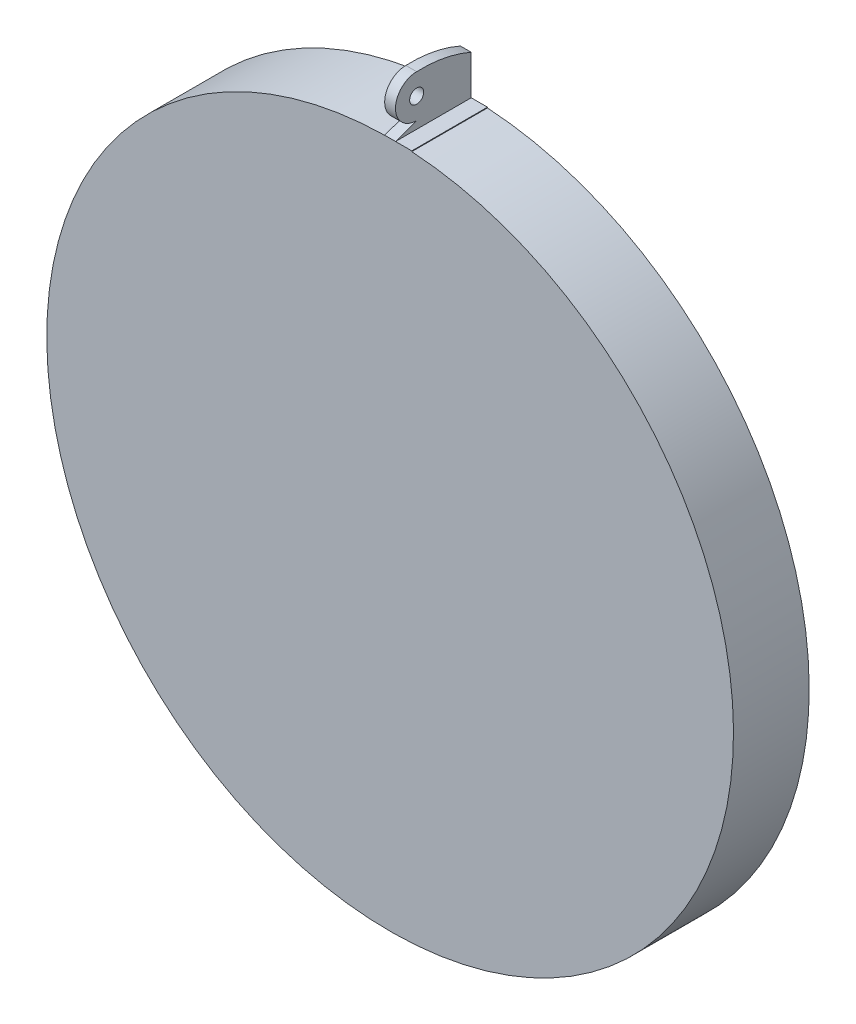
ISO-10303-21;
HEADER;
FILE_DESCRIPTION(('STEP AP214'),'2;1');
FILE_NAME('part.step','',(''),(''),'','','');
FILE_SCHEMA(('AUTOMOTIVE_DESIGN { 1 0 10303 214 1 1 1 1 }'));
ENDSEC;
DATA;
#1=APPLICATION_CONTEXT('core data for automotive mechanical design processes');
#2=APPLICATION_PROTOCOL_DEFINITION('international standard','automotive_design',2000,#1);
#3=PRODUCT_CONTEXT('',#1,'mechanical');
#4=PRODUCT('Part','Part','',(#3));
#5=PRODUCT_RELATED_PRODUCT_CATEGORY('part','',(#4));
#6=PRODUCT_DEFINITION_FORMATION('','',#4);
#7=PRODUCT_DEFINITION_CONTEXT('part definition',#1,'design');
#8=PRODUCT_DEFINITION('design','',#6,#7);
#9=PRODUCT_DEFINITION_SHAPE('','',#8);
#10=(LENGTH_UNIT() NAMED_UNIT(*) SI_UNIT(.MILLI.,.METRE.));
#11=(NAMED_UNIT(*) PLANE_ANGLE_UNIT() SI_UNIT($,.RADIAN.));
#12=(NAMED_UNIT(*) SI_UNIT($,.STERADIAN.) SOLID_ANGLE_UNIT());
#13=UNCERTAINTY_MEASURE_WITH_UNIT(LENGTH_MEASURE(1.E-05),#10,'distance_accuracy_value','');
#14=(GEOMETRIC_REPRESENTATION_CONTEXT(3) GLOBAL_UNCERTAINTY_ASSIGNED_CONTEXT((#13)) GLOBAL_UNIT_ASSIGNED_CONTEXT((#10,
#11,#12)) REPRESENTATION_CONTEXT('',''));
#15=CARTESIAN_POINT('',(0.,0.,0.));
#16=DIRECTION('',(0.,0.,1.));
#17=DIRECTION('',(1.,0.,0.));
#18=AXIS2_PLACEMENT_3D('',#15,#16,#17);
#19=CARTESIAN_POINT('',(0.,0.,42.));
#20=DIRECTION('',(0.,0.,-1.));
#21=DIRECTION('',(-1.,0.,0.));
#22=AXIS2_PLACEMENT_3D('',#19,#20,#21);
#23=CYLINDRICAL_SURFACE('',#22,56.097029569979);
#24=CARTESIAN_POINT('',(0.,0.,20.));
#25=DIRECTION('',(0.,0.,-1.));
#26=DIRECTION('',(-1.,0.,0.));
#27=AXIS2_PLACEMENT_3D('',#24,#25,#26);
#28=CIRCLE('',#27,56.097029569979);
#29=CARTESIAN_POINT('',(-56.097029569979,0.,20.));
#30=VERTEX_POINT('',#29);
#31=EDGE_CURVE('E197',#30,#30,#28,.T.);
#32=ORIENTED_EDGE('',*,*,#31,.T.);
#33=EDGE_LOOP('',(#32));
#34=FACE_BOUND('',#33,.T.);
#35=CARTESIAN_POINT('',(0.,0.,21.));
#36=DIRECTION('',(0.,0.,1.));
#37=DIRECTION('',(1.,0.,0.));
#38=AXIS2_PLACEMENT_3D('',#35,#36,#37);
#39=CIRCLE('',#38,56.097029569979);
#40=CARTESIAN_POINT('',(56.097029569979,0.,21.));
#41=VERTEX_POINT('',#40);
#42=EDGE_CURVE('E11',#41,#41,#39,.F.);
#43=ORIENTED_EDGE('',*,*,#42,.F.);
#44=EDGE_LOOP('',(#43));
#45=FACE_BOUND('',#44,.T.);
#46=ADVANCED_FACE('F39',(#34,#45),#23,.F.);
#47=CARTESIAN_POINT('',(0.,0.,23.));
#48=DIRECTION('',(0.,0.,-1.));
#49=DIRECTION('',(-1.,0.,0.));
#50=AXIS2_PLACEMENT_3D('',#47,#48,#49);
#51=CYLINDRICAL_SURFACE('',#50,63.5);
#52=DIRECTION('',(0.,0.,-1.));
#53=VECTOR('',#52,1.);
#54=CARTESIAN_POINT('',(-0.999999999999986,63.4921254960015,23.));
#55=LINE('',#54,#53);
#56=CARTESIAN_POINT('',(-0.999999999999985,63.4921254960015,23.));
#57=VERTEX_POINT('',#56);
#58=CARTESIAN_POINT('',(-0.999999999999986,63.4921254960015,8.99999999999998));
#59=VERTEX_POINT('',#58);
#60=EDGE_CURVE('E103',#57,#59,#55,.T.);
#61=ORIENTED_EDGE('',*,*,#60,.T.);
#62=CARTESIAN_POINT('',(0.,0.,8.99999999999998));
#63=DIRECTION('',(0.,0.,-1.));
#64=DIRECTION('',(-1.,0.,0.));
#65=AXIS2_PLACEMENT_3D('',#62,#63,#64);
#66=CIRCLE('',#65,63.5);
#67=CARTESIAN_POINT('',(3.99999999999998,63.3738905228328,8.99999999999998));
#68=VERTEX_POINT('',#67);
#69=EDGE_CURVE('E105',#68,#59,#66,.T.);
#70=ORIENTED_EDGE('',*,*,#69,.F.);
#71=DIRECTION('',(0.,0.,-1.));
#72=VECTOR('',#71,1.);
#73=CARTESIAN_POINT('',(3.99999999999998,63.3738905228328,23.));
#74=LINE('',#73,#72);
#75=CARTESIAN_POINT('',(3.99999999999998,63.3738905228328,23.));
#76=VERTEX_POINT('',#75);
#77=EDGE_CURVE('E190',#68,#76,#74,.F.);
#78=ORIENTED_EDGE('',*,*,#77,.T.);
#79=CARTESIAN_POINT('',(0.,0.,23.));
#80=DIRECTION('',(0.,0.,1.));
#81=DIRECTION('',(1.,0.,0.));
#82=AXIS2_PLACEMENT_3D('',#79,#80,#81);
#83=CIRCLE('',#82,63.5);
#84=EDGE_CURVE('E43',#57,#76,#83,.T.);
#85=ORIENTED_EDGE('',*,*,#84,.F.);
#86=EDGE_LOOP('',(#61,#70,#78,#85));
#87=FACE_BOUND('',#86,.T.);
#88=ADVANCED_FACE('F41',(#87),#51,.T.);
#89=CARTESIAN_POINT('',(0.,0.,23.));
#90=DIRECTION('',(0.,0.,-1.));
#91=DIRECTION('',(-1.,0.,0.));
#92=AXIS2_PLACEMENT_3D('',#89,#90,#91);
#93=CYLINDRICAL_SURFACE('',#92,60.5);
#94=CARTESIAN_POINT('',(0.,0.,20.));
#95=DIRECTION('',(0.,0.,1.));
#96=DIRECTION('',(1.,0.,0.));
#97=AXIS2_PLACEMENT_3D('',#94,#95,#96);
#98=CIRCLE('',#97,60.5);
#99=CARTESIAN_POINT('',(60.5,0.,20.));
#100=VERTEX_POINT('',#99);
#101=EDGE_CURVE('E203',#100,#100,#98,.T.);
#102=ORIENTED_EDGE('',*,*,#101,.T.);
#103=EDGE_LOOP('',(#102));
#104=FACE_BOUND('',#103,.T.);
#105=CARTESIAN_POINT('',(0.,0.,8.99999999999998));
#106=DIRECTION('',(0.,0.,-1.));
#107=DIRECTION('',(-1.,0.,0.));
#108=AXIS2_PLACEMENT_3D('',#105,#106,#107);
#109=CIRCLE('',#108,60.5);
#110=CARTESIAN_POINT('',(-60.5,0.,8.99999999999998));
#111=VERTEX_POINT('',#110);
#112=EDGE_CURVE('E122',#111,#111,#109,.T.);
#113=ORIENTED_EDGE('',*,*,#112,.T.);
#114=EDGE_LOOP('',(#113));
#115=FACE_BOUND('',#114,.T.);
#116=ADVANCED_FACE('F252',(#104,#115),#93,.F.);
#117=CARTESIAN_POINT('',(0.,63.5,0.));
#118=DIRECTION('',(0.,-1.,0.));
#119=DIRECTION('',(0.,0.,-1.));
#120=AXIS2_PLACEMENT_3D('',#117,#118,#119);
#121=PLANE('',#120);
#122=DIRECTION('',(0.,0.,1.));
#123=VECTOR('',#122,1.);
#124=CARTESIAN_POINT('',(3.99999999999998,63.5,23.));
#125=LINE('',#124,#123);
#126=CARTESIAN_POINT('',(3.99999999999998,63.5,8.99999999999998));
#127=VERTEX_POINT('',#126);
#128=CARTESIAN_POINT('',(3.99999999999998,63.5,23.));
#129=VERTEX_POINT('',#128);
#130=EDGE_CURVE('E187',#127,#129,#125,.T.);
#131=ORIENTED_EDGE('',*,*,#130,.F.);
#132=DIRECTION('',(-1.,0.,0.));
#133=VECTOR('',#132,1.);
#134=CARTESIAN_POINT('',(0.,63.5,8.99999999999998));
#135=LINE('',#134,#133);
#136=CARTESIAN_POINT('',(0.999999999999986,63.5,8.99999999999998));
#137=VERTEX_POINT('',#136);
#138=EDGE_CURVE('E138',#127,#137,#135,.T.);
#139=ORIENTED_EDGE('',*,*,#138,.T.);
#140=DIRECTION('',(0.,0.,-1.));
#141=VECTOR('',#140,1.);
#142=CARTESIAN_POINT('',(0.999999999999986,63.5,23.));
#143=LINE('',#142,#141);
#144=CARTESIAN_POINT('',(0.999999999999986,63.5,23.));
#145=VERTEX_POINT('',#144);
#146=EDGE_CURVE('E63',#145,#137,#143,.T.);
#147=ORIENTED_EDGE('',*,*,#146,.F.);
#148=DIRECTION('',(-1.,0.,0.));
#149=VECTOR('',#148,1.);
#150=CARTESIAN_POINT('',(-0.999999999999986,63.5,23.));
#151=LINE('',#150,#149);
#152=EDGE_CURVE('E191',#129,#145,#151,.T.);
#153=ORIENTED_EDGE('',*,*,#152,.F.);
#154=EDGE_LOOP('',(#131,#139,#147,#153));
#155=FACE_BOUND('',#154,.T.);
#156=ADVANCED_FACE('F215',(#155),#121,.F.);
#157=CARTESIAN_POINT('',(0.,0.,23.));
#158=DIRECTION('',(0.,0.,1.));
#159=DIRECTION('',(1.,0.,0.));
#160=AXIS2_PLACEMENT_3D('',#157,#158,#159);
#161=PLANE('',#160);
#162=DIRECTION('',(0.,1.,0.));
#163=VECTOR('',#162,1.);
#164=CARTESIAN_POINT('',(-0.999999999999986,-63.501,23.));
#165=LINE('',#164,#163);
#166=CARTESIAN_POINT('',(-0.999999999999986,63.5,23.));
#167=VERTEX_POINT('',#166);
#168=EDGE_CURVE('E112',#57,#167,#165,.T.);
#169=ORIENTED_EDGE('',*,*,#168,.F.);
#170=ORIENTED_EDGE('',*,*,#84,.T.);
#171=DIRECTION('',(0.,1.,0.));
#172=VECTOR('',#171,1.);
#173=CARTESIAN_POINT('',(3.99999999999998,-63.501,23.));
#174=LINE('',#173,#172);
#175=EDGE_CURVE('E183',#76,#129,#174,.T.);
#176=ORIENTED_EDGE('',*,*,#175,.T.);
#177=ORIENTED_EDGE('',*,*,#152,.T.);
#178=EDGE_CURVE('E194',#145,#167,#151,.T.);
#179=ORIENTED_EDGE('',*,*,#178,.T.);
#180=EDGE_LOOP('',(#169,#170,#176,#177,#179));
#181=FACE_BOUND('',#180,.T.);
#182=ADVANCED_FACE('F211',(#181),#161,.T.);
#183=CARTESIAN_POINT('',(0.,0.,20.));
#184=DIRECTION('',(0.,0.,1.));
#185=DIRECTION('',(1.,0.,0.));
#186=AXIS2_PLACEMENT_3D('',#183,#184,#185);
#187=PLANE('',#186);
#188=ORIENTED_EDGE('',*,*,#31,.F.);
#189=EDGE_LOOP('',(#188));
#190=FACE_BOUND('',#189,.T.);
#191=ORIENTED_EDGE('',*,*,#101,.F.);
#192=EDGE_LOOP('',(#191));
#193=FACE_BOUND('',#192,.T.);
#194=ADVANCED_FACE('F241',(#190,#193),#187,.F.);
#195=CARTESIAN_POINT('',(3.99999999999998,-63.501,23.));
#196=DIRECTION('',(-1.,0.,0.));
#197=DIRECTION('',(0.,0.,1.));
#198=AXIS2_PLACEMENT_3D('',#195,#196,#197);
#199=PLANE('',#198);
#200=ORIENTED_EDGE('',*,*,#77,.F.);
#201=DIRECTION('',(0.,1.,0.));
#202=VECTOR('',#201,1.);
#203=CARTESIAN_POINT('',(3.99999999999998,-63.501,8.99999999999998));
#204=LINE('',#203,#202);
#205=EDGE_CURVE('E120',#68,#127,#204,.T.);
#206=ORIENTED_EDGE('',*,*,#205,.T.);
#207=ORIENTED_EDGE('',*,*,#130,.T.);
#208=ORIENTED_EDGE('',*,*,#175,.F.);
#209=EDGE_LOOP('',(#200,#206,#207,#208));
#210=FACE_BOUND('',#209,.T.);
#211=ADVANCED_FACE('F213',(#210),#199,.F.);
#212=CARTESIAN_POINT('',(-0.999999999999986,50.2901693666308,18.1616408489232));
#213=DIRECTION('',(1.,0.,0.));
#214=DIRECTION('',(0.,0.,-1.));
#215=AXIS2_PLACEMENT_3D('',#212,#213,#214);
#216=CYLINDRICAL_SURFACE('',#215,22.4576228414223);
#217=DIRECTION('',(1.,0.,0.));
#218=VECTOR('',#217,1.);
#219=CARTESIAN_POINT('',(-0.999999999999986,70.7940509660479,8.99999999999998));
#220=LINE('',#219,#218);
#221=CARTESIAN_POINT('',(-0.999999999999986,70.7940509660479,8.99999999999998));
#222=VERTEX_POINT('',#221);
#223=CARTESIAN_POINT('',(0.999999999999986,70.7940509660479,8.99999999999998));
#224=VERTEX_POINT('',#223);
#225=EDGE_CURVE('E131',#222,#224,#220,.T.);
#226=ORIENTED_EDGE('',*,*,#225,.F.);
#227=CARTESIAN_POINT('',(-0.999999999999986,50.2901693666308,18.1616408489232));
#228=DIRECTION('',(1.,0.,0.));
#229=DIRECTION('',(0.,0.,1.));
#230=AXIS2_PLACEMENT_3D('',#227,#228,#229);
#231=CIRCLE('',#230,22.4576228414223);
#232=CARTESIAN_POINT('',(-0.999999999999986,72.7284812952258,19.0927592531248));
#233=VERTEX_POINT('',#232);
#234=EDGE_CURVE('E129',#222,#233,#231,.T.);
#235=ORIENTED_EDGE('',*,*,#234,.T.);
#236=DIRECTION('',(1.,0.,0.));
#237=VECTOR('',#236,1.);
#238=CARTESIAN_POINT('',(-0.999999999999986,72.7284812952258,19.0927592531248));
#239=LINE('',#238,#237);
#240=CARTESIAN_POINT('',(0.999999999999986,72.7284812952258,19.0927592531248));
#241=VERTEX_POINT('',#240);
#242=EDGE_CURVE('E179',#233,#241,#239,.T.);
#243=ORIENTED_EDGE('',*,*,#242,.T.);
#244=CARTESIAN_POINT('',(0.999999999999986,50.2901693666308,18.1616408489232));
#245=DIRECTION('',(1.,0.,0.));
#246=DIRECTION('',(0.,0.,1.));
#247=AXIS2_PLACEMENT_3D('',#244,#245,#246);
#248=CIRCLE('',#247,22.4576228414223);
#249=EDGE_CURVE('E152',#224,#241,#248,.T.);
#250=ORIENTED_EDGE('',*,*,#249,.F.);
#251=EDGE_LOOP('',(#226,#235,#243,#250));
#252=FACE_BOUND('',#251,.T.);
#253=ADVANCED_FACE('F231',(#252),#216,.T.);
#254=CARTESIAN_POINT('',(-0.999999999999986,-99.963694164809,-37.5589199816853));
#255=DIRECTION('',(1.,0.,0.));
#256=DIRECTION('',(0.,0.,-1.));
#257=AXIS2_PLACEMENT_3D('',#254,#255,#256);
#258=CYLINDRICAL_SURFACE('',#257,174.320859622004);
#259=CARTESIAN_POINT('',(-0.999999999999986,-99.963694164809,-37.5589199816853));
#260=DIRECTION('',(1.,0.,0.));
#261=DIRECTION('',(0.,0.,-1.));
#262=AXIS2_PLACEMENT_3D('',#259,#260,#261);
#263=CIRCLE('',#262,174.320859622004);
#264=CARTESIAN_POINT('',(-0.999999999999986,64.8948795862415,19.0927592531248));
#265=VERTEX_POINT('',#264);
#266=EDGE_CURVE('E175',#265,#167,#263,.T.);
#267=ORIENTED_EDGE('',*,*,#266,.T.);
#268=ORIENTED_EDGE('',*,*,#178,.F.);
#269=CARTESIAN_POINT('',(0.999999999999986,-99.963694164809,-37.5589199816853));
#270=DIRECTION('',(1.,0.,0.));
#271=DIRECTION('',(0.,0.,-1.));
#272=AXIS2_PLACEMENT_3D('',#269,#270,#271);
#273=CIRCLE('',#272,174.320859622004);
#274=CARTESIAN_POINT('',(0.999999999999986,64.8948795862415,19.0927592531248));
#275=VERTEX_POINT('',#274);
#276=EDGE_CURVE('E159',#275,#145,#273,.T.);
#277=ORIENTED_EDGE('',*,*,#276,.F.);
#278=DIRECTION('',(1.,0.,0.));
#279=VECTOR('',#278,1.);
#280=CARTESIAN_POINT('',(-0.999999999999986,64.8948795862415,19.0927592531248));
#281=LINE('',#280,#279);
#282=EDGE_CURVE('E180',#265,#275,#281,.T.);
#283=ORIENTED_EDGE('',*,*,#282,.F.);
#284=EDGE_LOOP('',(#267,#268,#277,#283));
#285=FACE_BOUND('',#284,.T.);
#286=ADVANCED_FACE('F219',(#285),#258,.T.);
#287=CARTESIAN_POINT('',(-0.999999999999986,68.8116804407337,19.0927592531248));
#288=DIRECTION('',(1.,0.,0.));
#289=DIRECTION('',(0.,0.,-1.));
#290=AXIS2_PLACEMENT_3D('',#287,#288,#289);
#291=CYLINDRICAL_SURFACE('',#290,3.91680085449216);
#292=ORIENTED_EDGE('',*,*,#282,.T.);
#293=CARTESIAN_POINT('',(0.999999999999986,68.8116804407337,19.0927592531248));
#294=DIRECTION('',(1.,0.,0.));
#295=DIRECTION('',(0.,0.,-1.));
#296=AXIS2_PLACEMENT_3D('',#293,#294,#295);
#297=CIRCLE('',#296,3.91680085449216);
#298=EDGE_CURVE('E155',#241,#275,#297,.T.);
#299=ORIENTED_EDGE('',*,*,#298,.F.);
#300=ORIENTED_EDGE('',*,*,#242,.F.);
#301=CARTESIAN_POINT('',(-0.999999999999986,68.8116804407337,19.0927592531248));
#302=DIRECTION('',(1.,0.,0.));
#303=DIRECTION('',(0.,0.,-1.));
#304=AXIS2_PLACEMENT_3D('',#301,#302,#303);
#305=CIRCLE('',#304,3.91680085449216);
#306=EDGE_CURVE('E171',#233,#265,#305,.T.);
#307=ORIENTED_EDGE('',*,*,#306,.T.);
#308=EDGE_LOOP('',(#292,#299,#300,#307));
#309=FACE_BOUND('',#308,.T.);
#310=ADVANCED_FACE('F229',(#309),#291,.T.);
#311=CARTESIAN_POINT('',(-0.999999999999986,50.2901693666308,18.1616408489232));
#312=DIRECTION('',(-1.,0.,0.));
#313=DIRECTION('',(0.,0.,1.));
#314=AXIS2_PLACEMENT_3D('',#311,#312,#313);
#315=PLANE('',#314);
#316=DIRECTION('',(0.,1.,0.));
#317=VECTOR('',#316,1.);
#318=CARTESIAN_POINT('',(-0.999999999999986,50.2901693666308,8.99999999999998));
#319=LINE('',#318,#317);
#320=EDGE_CURVE('E117',#59,#222,#319,.T.);
#321=ORIENTED_EDGE('',*,*,#320,.F.);
#322=ORIENTED_EDGE('',*,*,#60,.F.);
#323=ORIENTED_EDGE('',*,*,#168,.T.);
#324=ORIENTED_EDGE('',*,*,#266,.F.);
#325=ORIENTED_EDGE('',*,*,#306,.F.);
#326=ORIENTED_EDGE('',*,*,#234,.F.);
#327=EDGE_LOOP('',(#321,#322,#323,#324,#325,#326));
#328=FACE_BOUND('',#327,.T.);
#329=CARTESIAN_POINT('',(-0.999999999999986,68.8116804407337,19.0927592531248));
#330=DIRECTION('',(1.,0.,0.));
#331=DIRECTION('',(0.,0.,-1.));
#332=AXIS2_PLACEMENT_3D('',#329,#330,#331);
#333=CIRCLE('',#332,1.3);
#334=CARTESIAN_POINT('',(-0.999999999999986,68.8116804407337,17.7927592531248));
#335=VERTEX_POINT('',#334);
#336=EDGE_CURVE('E165',#335,#335,#333,.T.);
#337=ORIENTED_EDGE('',*,*,#336,.T.);
#338=EDGE_LOOP('',(#337));
#339=FACE_BOUND('',#338,.T.);
#340=ADVANCED_FACE('F126',(#328,#339),#315,.T.);
#341=CARTESIAN_POINT('',(-0.999999999999986,68.8116804407337,19.0927592531248));
#342=DIRECTION('',(1.,0.,0.));
#343=DIRECTION('',(0.,0.,-1.));
#344=AXIS2_PLACEMENT_3D('',#341,#342,#343);
#345=CYLINDRICAL_SURFACE('',#344,1.3);
#346=ORIENTED_EDGE('',*,*,#336,.F.);
#347=EDGE_LOOP('',(#346));
#348=FACE_BOUND('',#347,.T.);
#349=CARTESIAN_POINT('',(0.999999999999986,68.8116804407337,19.0927592531248));
#350=DIRECTION('',(1.,0.,0.));
#351=DIRECTION('',(0.,0.,-1.));
#352=AXIS2_PLACEMENT_3D('',#349,#350,#351);
#353=CIRCLE('',#352,1.3);
#354=CARTESIAN_POINT('',(0.999999999999986,68.8116804407337,17.7927592531248));
#355=VERTEX_POINT('',#354);
#356=EDGE_CURVE('E111',#355,#355,#353,.T.);
#357=ORIENTED_EDGE('',*,*,#356,.T.);
#358=EDGE_LOOP('',(#357));
#359=FACE_BOUND('',#358,.T.);
#360=ADVANCED_FACE('F294',(#348,#359),#345,.F.);
#361=CARTESIAN_POINT('',(0.999999999999986,50.2901693666308,18.1616408489232));
#362=DIRECTION('',(-1.,0.,0.));
#363=DIRECTION('',(0.,0.,1.));
#364=AXIS2_PLACEMENT_3D('',#361,#362,#363);
#365=PLANE('',#364);
#366=ORIENTED_EDGE('',*,*,#146,.T.);
#367=DIRECTION('',(0.,1.,0.));
#368=VECTOR('',#367,1.);
#369=CARTESIAN_POINT('',(0.999999999999986,50.2901693666308,8.99999999999998));
#370=LINE('',#369,#368);
#371=EDGE_CURVE('E123',#137,#224,#370,.T.);
#372=ORIENTED_EDGE('',*,*,#371,.T.);
#373=ORIENTED_EDGE('',*,*,#249,.T.);
#374=ORIENTED_EDGE('',*,*,#298,.T.);
#375=ORIENTED_EDGE('',*,*,#276,.T.);
#376=EDGE_LOOP('',(#366,#372,#373,#374,#375));
#377=FACE_BOUND('',#376,.T.);
#378=ORIENTED_EDGE('',*,*,#356,.F.);
#379=EDGE_LOOP('',(#378));
#380=FACE_BOUND('',#379,.T.);
#381=ADVANCED_FACE('F223',(#377,#380),#365,.F.);
#382=CARTESIAN_POINT('',(0.,0.,8.99999999999998));
#383=DIRECTION('',(0.,0.,-1.));
#384=DIRECTION('',(-1.,0.,0.));
#385=AXIS2_PLACEMENT_3D('',#382,#383,#384);
#386=PLANE('',#385);
#387=ORIENTED_EDGE('',*,*,#69,.T.);
#388=ORIENTED_EDGE('',*,*,#320,.T.);
#389=ORIENTED_EDGE('',*,*,#225,.T.);
#390=ORIENTED_EDGE('',*,*,#371,.F.);
#391=ORIENTED_EDGE('',*,*,#138,.F.);
#392=ORIENTED_EDGE('',*,*,#205,.F.);
#393=EDGE_LOOP('',(#387,#388,#389,#390,#391,#392));
#394=FACE_BOUND('',#393,.T.);
#395=ORIENTED_EDGE('',*,*,#112,.F.);
#396=EDGE_LOOP('',(#395));
#397=FACE_BOUND('',#396,.T.);
#398=ADVANCED_FACE('F115',(#394,#397),#386,.T.);
#399=CARTESIAN_POINT('',(0.,0.,21.));
#400=DIRECTION('',(0.,0.,1.));
#401=DIRECTION('',(1.,0.,0.));
#402=AXIS2_PLACEMENT_3D('',#399,#400,#401);
#403=PLANE('',#402);
#404=ORIENTED_EDGE('',*,*,#42,.T.);
#405=EDGE_LOOP('',(#404));
#406=FACE_BOUND('',#405,.T.);
#407=ADVANCED_FACE('F298',(#406),#403,.F.);
#408=CLOSED_SHELL('',(#46,#88,#116,#156,#182,#194,#211,#253,#286,#310,#340,#360,#381,#398,#407));
#409=MANIFOLD_SOLID_BREP('B2',#408);
#410=ADVANCED_BREP_SHAPE_REPRESENTATION('',(#18,#409),#14);
#411=SHAPE_DEFINITION_REPRESENTATION(#9,#410);
ENDSEC;
END-ISO-10303-21;
